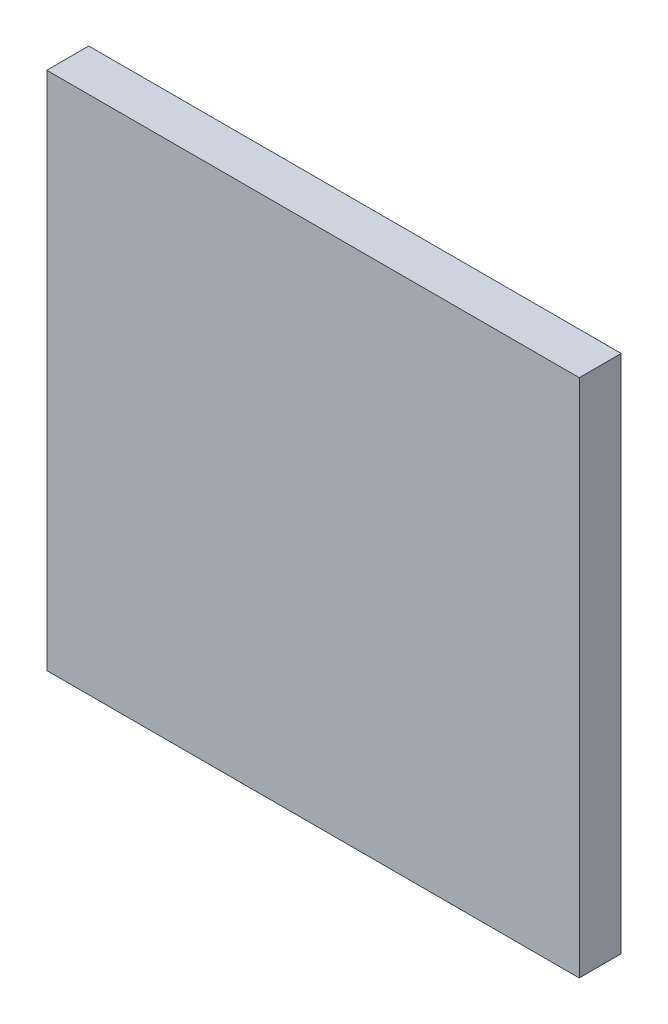
ISO-10303-21;
HEADER;
FILE_DESCRIPTION(('STEP AP214'),'2;1');
FILE_NAME('part.step','',(''),(''),'','','');
FILE_SCHEMA(('AUTOMOTIVE_DESIGN { 1 0 10303 214 1 1 1 1 }'));
ENDSEC;
DATA;
#1=APPLICATION_CONTEXT('core data for automotive mechanical design processes');
#2=APPLICATION_PROTOCOL_DEFINITION('international standard','automotive_design',2000,#1);
#3=PRODUCT_CONTEXT('',#1,'mechanical');
#4=PRODUCT('Part','Part','',(#3));
#5=PRODUCT_RELATED_PRODUCT_CATEGORY('part','',(#4));
#6=PRODUCT_DEFINITION_FORMATION('','',#4);
#7=PRODUCT_DEFINITION_CONTEXT('part definition',#1,'design');
#8=PRODUCT_DEFINITION('design','',#6,#7);
#9=PRODUCT_DEFINITION_SHAPE('','',#8);
#10=(LENGTH_UNIT() NAMED_UNIT(*) SI_UNIT(.MILLI.,.METRE.));
#11=(NAMED_UNIT(*) PLANE_ANGLE_UNIT() SI_UNIT($,.RADIAN.));
#12=(NAMED_UNIT(*) SI_UNIT($,.STERADIAN.) SOLID_ANGLE_UNIT());
#13=UNCERTAINTY_MEASURE_WITH_UNIT(LENGTH_MEASURE(1.E-05),#10,'distance_accuracy_value','');
#14=(GEOMETRIC_REPRESENTATION_CONTEXT(3) GLOBAL_UNCERTAINTY_ASSIGNED_CONTEXT((#13)) GLOBAL_UNIT_ASSIGNED_CONTEXT((#10,
#11,#12)) REPRESENTATION_CONTEXT('',''));
#15=CARTESIAN_POINT('',(0.,0.,0.));
#16=DIRECTION('',(0.,0.,1.));
#17=DIRECTION('',(1.,0.,0.));
#18=AXIS2_PLACEMENT_3D('',#15,#16,#17);
#19=CARTESIAN_POINT('',(12.69,0.,-0.035));
#20=DIRECTION('',(0.,1.,0.));
#21=DIRECTION('',(1.,0.,0.));
#22=AXIS2_PLACEMENT_3D('',#19,#20,#21);
#23=PLANE('',#22);
#24=DIRECTION('',(1.,0.,0.));
#25=VECTOR('',#24,1.);
#26=CARTESIAN_POINT('',(12.69,0.,-1.035));
#27=LINE('',#26,#25);
#28=CARTESIAN_POINT('',(0.,0.,-1.035));
#29=VERTEX_POINT('',#28);
#30=CARTESIAN_POINT('',(12.69,0.,-1.035));
#31=VERTEX_POINT('',#30);
#32=EDGE_CURVE('E11',#29,#31,#27,.T.);
#33=ORIENTED_EDGE('',*,*,#32,.T.);
#34=DIRECTION('',(0.,0.,-1.));
#35=VECTOR('',#34,1.);
#36=CARTESIAN_POINT('',(12.69,0.,-0.035));
#37=LINE('',#36,#35);
#38=CARTESIAN_POINT('',(12.69,0.,-0.035));
#39=VERTEX_POINT('',#38);
#40=EDGE_CURVE('E25',#39,#31,#37,.T.);
#41=ORIENTED_EDGE('',*,*,#40,.F.);
#42=DIRECTION('',(1.,0.,0.));
#43=VECTOR('',#42,1.);
#44=CARTESIAN_POINT('',(12.69,0.,-0.035));
#45=LINE('',#44,#43);
#46=CARTESIAN_POINT('',(0.,0.,-0.035));
#47=VERTEX_POINT('',#46);
#48=EDGE_CURVE('E108',#47,#39,#45,.T.);
#49=ORIENTED_EDGE('',*,*,#48,.F.);
#50=DIRECTION('',(0.,0.,-1.));
#51=VECTOR('',#50,1.);
#52=CARTESIAN_POINT('',(0.,0.,-0.035));
#53=LINE('',#52,#51);
#54=EDGE_CURVE('E89',#47,#29,#53,.T.);
#55=ORIENTED_EDGE('',*,*,#54,.T.);
#56=EDGE_LOOP('',(#33,#41,#49,#55));
#57=FACE_BOUND('',#56,.T.);
#58=ADVANCED_FACE('F17',(#57),#23,.F.);
#59=CARTESIAN_POINT('',(12.69,12.39,-0.035));
#60=DIRECTION('',(-1.,0.,0.));
#61=DIRECTION('',(0.,0.,1.));
#62=AXIS2_PLACEMENT_3D('',#59,#60,#61);
#63=PLANE('',#62);
#64=DIRECTION('',(0.,1.,0.));
#65=VECTOR('',#64,1.);
#66=CARTESIAN_POINT('',(12.69,12.39,-1.035));
#67=LINE('',#66,#65);
#68=CARTESIAN_POINT('',(12.69,12.39,-1.035));
#69=VERTEX_POINT('',#68);
#70=EDGE_CURVE('E103',#31,#69,#67,.T.);
#71=ORIENTED_EDGE('',*,*,#70,.T.);
#72=DIRECTION('',(0.,0.,-1.));
#73=VECTOR('',#72,1.);
#74=CARTESIAN_POINT('',(12.69,12.39,-0.035));
#75=LINE('',#74,#73);
#76=CARTESIAN_POINT('',(12.69,12.39,-0.035));
#77=VERTEX_POINT('',#76);
#78=EDGE_CURVE('E100',#77,#69,#75,.T.);
#79=ORIENTED_EDGE('',*,*,#78,.F.);
#80=DIRECTION('',(0.,1.,0.));
#81=VECTOR('',#80,1.);
#82=CARTESIAN_POINT('',(12.69,12.39,-0.035));
#83=LINE('',#82,#81);
#84=EDGE_CURVE('E83',#39,#77,#83,.T.);
#85=ORIENTED_EDGE('',*,*,#84,.F.);
#86=ORIENTED_EDGE('',*,*,#40,.T.);
#87=EDGE_LOOP('',(#71,#79,#85,#86));
#88=FACE_BOUND('',#87,.T.);
#89=ADVANCED_FACE('F112',(#88),#63,.F.);
#90=CARTESIAN_POINT('',(0.,12.39,-0.035));
#91=DIRECTION('',(0.,-1.,0.));
#92=DIRECTION('',(0.,0.,-1.));
#93=AXIS2_PLACEMENT_3D('',#90,#91,#92);
#94=PLANE('',#93);
#95=DIRECTION('',(-1.,0.,0.));
#96=VECTOR('',#95,1.);
#97=CARTESIAN_POINT('',(0.,12.39,-1.035));
#98=LINE('',#97,#96);
#99=CARTESIAN_POINT('',(0.,12.39,-1.035));
#100=VERTEX_POINT('',#99);
#101=EDGE_CURVE('E70',#69,#100,#98,.T.);
#102=ORIENTED_EDGE('',*,*,#101,.T.);
#103=DIRECTION('',(0.,0.,-1.));
#104=VECTOR('',#103,1.);
#105=CARTESIAN_POINT('',(0.,12.39,-0.035));
#106=LINE('',#105,#104);
#107=CARTESIAN_POINT('',(0.,12.39,-0.035));
#108=VERTEX_POINT('',#107);
#109=EDGE_CURVE('E64',#108,#100,#106,.T.);
#110=ORIENTED_EDGE('',*,*,#109,.F.);
#111=DIRECTION('',(-1.,0.,0.));
#112=VECTOR('',#111,1.);
#113=CARTESIAN_POINT('',(0.,12.39,-0.035));
#114=LINE('',#113,#112);
#115=EDGE_CURVE('E68',#77,#108,#114,.T.);
#116=ORIENTED_EDGE('',*,*,#115,.F.);
#117=ORIENTED_EDGE('',*,*,#78,.T.);
#118=EDGE_LOOP('',(#102,#110,#116,#117));
#119=FACE_BOUND('',#118,.T.);
#120=ADVANCED_FACE('F66',(#119),#94,.F.);
#121=CARTESIAN_POINT('',(0.,0.,-0.035));
#122=DIRECTION('',(1.,0.,0.));
#123=DIRECTION('',(0.,1.,0.));
#124=AXIS2_PLACEMENT_3D('',#121,#122,#123);
#125=PLANE('',#124);
#126=DIRECTION('',(0.,-1.,0.));
#127=VECTOR('',#126,1.);
#128=CARTESIAN_POINT('',(0.,0.,-1.035));
#129=LINE('',#128,#127);
#130=EDGE_CURVE('E85',#100,#29,#129,.T.);
#131=ORIENTED_EDGE('',*,*,#130,.T.);
#132=ORIENTED_EDGE('',*,*,#54,.F.);
#133=DIRECTION('',(0.,-1.,0.));
#134=VECTOR('',#133,1.);
#135=CARTESIAN_POINT('',(0.,0.,-0.035));
#136=LINE('',#135,#134);
#137=EDGE_CURVE('E81',#108,#47,#136,.T.);
#138=ORIENTED_EDGE('',*,*,#137,.F.);
#139=ORIENTED_EDGE('',*,*,#109,.T.);
#140=EDGE_LOOP('',(#131,#132,#138,#139));
#141=FACE_BOUND('',#140,.T.);
#142=ADVANCED_FACE('F88',(#141),#125,.F.);
#143=CARTESIAN_POINT('',(0.,0.,-0.035));
#144=DIRECTION('',(0.,0.,-1.));
#145=DIRECTION('',(0.,-1.,0.));
#146=AXIS2_PLACEMENT_3D('',#143,#144,#145);
#147=PLANE('',#146);
#148=ORIENTED_EDGE('',*,*,#48,.T.);
#149=ORIENTED_EDGE('',*,*,#84,.T.);
#150=ORIENTED_EDGE('',*,*,#115,.T.);
#151=ORIENTED_EDGE('',*,*,#137,.T.);
#152=EDGE_LOOP('',(#148,#149,#150,#151));
#153=FACE_BOUND('',#152,.T.);
#154=ADVANCED_FACE('F80',(#153),#147,.F.);
#155=CARTESIAN_POINT('',(0.,0.,-1.035));
#156=DIRECTION('',(0.,0.,-1.));
#157=DIRECTION('',(0.,-1.,0.));
#158=AXIS2_PLACEMENT_3D('',#155,#156,#157);
#159=PLANE('',#158);
#160=ORIENTED_EDGE('',*,*,#32,.F.);
#161=ORIENTED_EDGE('',*,*,#130,.F.);
#162=ORIENTED_EDGE('',*,*,#101,.F.);
#163=ORIENTED_EDGE('',*,*,#70,.F.);
#164=EDGE_LOOP('',(#160,#161,#162,#163));
#165=FACE_BOUND('',#164,.T.);
#166=ADVANCED_FACE('F113',(#165),#159,.T.);
#167=CLOSED_SHELL('',(#58,#89,#120,#142,#154,#166));
#168=MANIFOLD_SOLID_BREP('B1',#167);
#169=ADVANCED_BREP_SHAPE_REPRESENTATION('',(#18,#168),#14);
#170=SHAPE_DEFINITION_REPRESENTATION(#9,#169);
ENDSEC;
END-ISO-10303-21;
